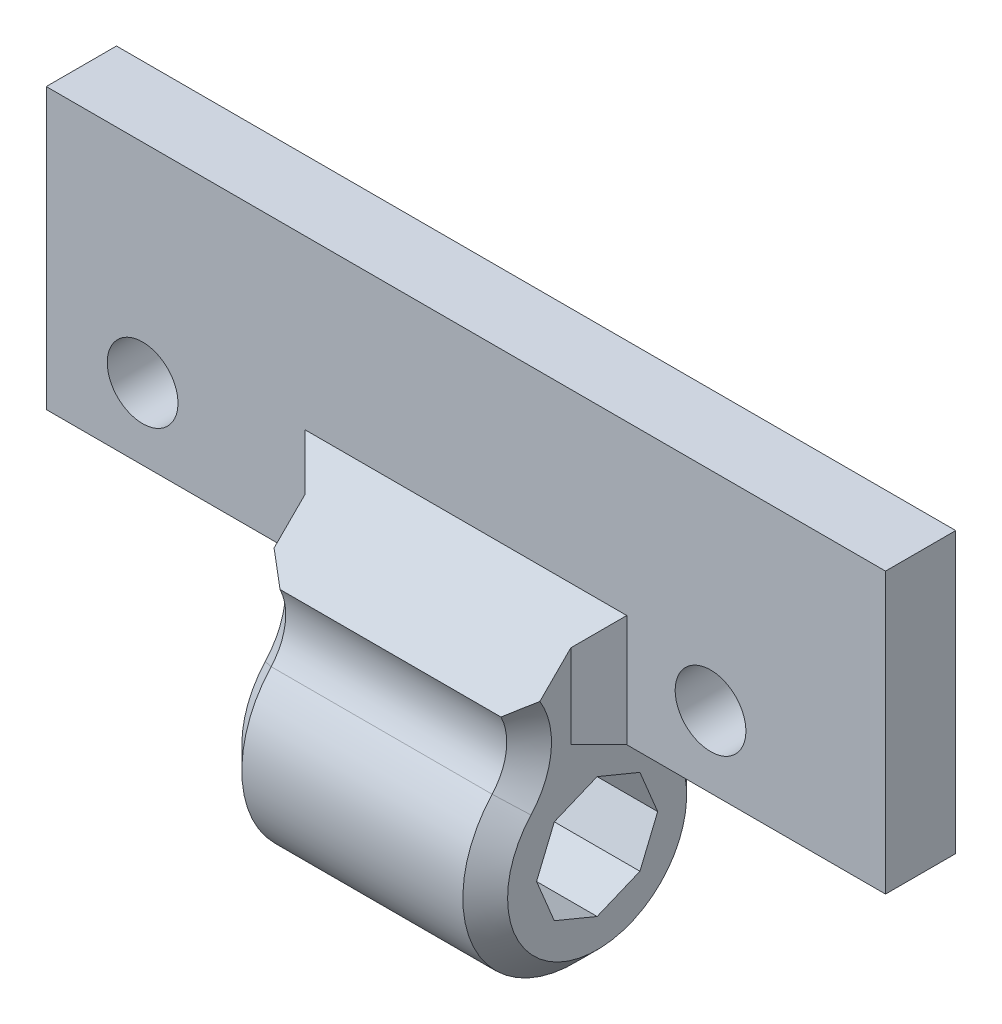
ISO-10303-21;
HEADER;
FILE_DESCRIPTION(('STEP AP214'),'2;1');
FILE_NAME('part.step','',(''),(''),'','','');
FILE_SCHEMA(('AUTOMOTIVE_DESIGN { 1 0 10303 214 1 1 1 1 }'));
ENDSEC;
DATA;
#1=APPLICATION_CONTEXT('core data for automotive mechanical design processes');
#2=APPLICATION_PROTOCOL_DEFINITION('international standard','automotive_design',2000,#1);
#3=PRODUCT_CONTEXT('',#1,'mechanical');
#4=PRODUCT('Part','Part','',(#3));
#5=PRODUCT_RELATED_PRODUCT_CATEGORY('part','',(#4));
#6=PRODUCT_DEFINITION_FORMATION('','',#4);
#7=PRODUCT_DEFINITION_CONTEXT('part definition',#1,'design');
#8=PRODUCT_DEFINITION('design','',#6,#7);
#9=PRODUCT_DEFINITION_SHAPE('','',#8);
#10=(LENGTH_UNIT() NAMED_UNIT(*) SI_UNIT(.MILLI.,.METRE.));
#11=(NAMED_UNIT(*) PLANE_ANGLE_UNIT() SI_UNIT($,.RADIAN.));
#12=(NAMED_UNIT(*) SI_UNIT($,.STERADIAN.) SOLID_ANGLE_UNIT());
#13=UNCERTAINTY_MEASURE_WITH_UNIT(LENGTH_MEASURE(1.E-05),#10,'distance_accuracy_value','');
#14=(GEOMETRIC_REPRESENTATION_CONTEXT(3) GLOBAL_UNCERTAINTY_ASSIGNED_CONTEXT((#13)) GLOBAL_UNIT_ASSIGNED_CONTEXT((#10,
#11,#12)) REPRESENTATION_CONTEXT('',''));
#15=CARTESIAN_POINT('',(0.,0.,0.));
#16=DIRECTION('',(0.,0.,1.));
#17=DIRECTION('',(1.,0.,0.));
#18=AXIS2_PLACEMENT_3D('',#15,#16,#17);
#19=CARTESIAN_POINT('',(10.25,0.423050926233683,7.));
#20=DIRECTION('',(1.,0.,0.));
#21=DIRECTION('',(0.,0.,-1.));
#22=AXIS2_PLACEMENT_3D('',#19,#20,#21);
#23=CYLINDRICAL_SURFACE('',#22,2.);
#24=CARTESIAN_POINT('',(18.95,0.423050926233683,7.));
#25=DIRECTION('',(-1.,0.,0.));
#26=DIRECTION('',(0.,0.,1.));
#27=AXIS2_PLACEMENT_3D('',#24,#25,#26);
#28=CIRCLE('',#27,2.);
#29=CARTESIAN_POINT('',(18.95,-0.925455628658212,5.52299963730079));
#30=VERTEX_POINT('',#29);
#31=CARTESIAN_POINT('',(18.95,1.30483529483931,5.20487985714527));
#32=VERTEX_POINT('',#31);
#33=EDGE_CURVE('E284',#30,#32,#28,.F.);
#34=ORIENTED_EDGE('',*,*,#33,.T.);
#35=DIRECTION('',(1.,0.,0.));
#36=VECTOR('',#35,1.);
#37=CARTESIAN_POINT('',(15.,1.30483529483931,5.20487985714527));
#38=LINE('',#37,#36);
#39=CARTESIAN_POINT('',(11.05,1.30483529483931,5.20487985714527));
#40=VERTEX_POINT('',#39);
#41=EDGE_CURVE('E394',#32,#40,#38,.F.);
#42=ORIENTED_EDGE('',*,*,#41,.T.);
#43=CARTESIAN_POINT('',(11.05,0.423050926233683,7.));
#44=DIRECTION('',(-1.,0.,0.));
#45=DIRECTION('',(0.,0.,1.));
#46=AXIS2_PLACEMENT_3D('',#43,#44,#45);
#47=CIRCLE('',#46,2.);
#48=CARTESIAN_POINT('',(11.05,-0.925455628658212,5.52299963730079));
#49=VERTEX_POINT('',#48);
#50=EDGE_CURVE('E281',#40,#49,#47,.T.);
#51=ORIENTED_EDGE('',*,*,#50,.T.);
#52=DIRECTION('',(1.,0.,0.));
#53=VECTOR('',#52,1.);
#54=CARTESIAN_POINT('',(10.25,-0.925455628658212,5.52299963730079));
#55=LINE('',#54,#53);
#56=EDGE_CURVE('E247',#30,#49,#55,.F.);
#57=ORIENTED_EDGE('',*,*,#56,.F.);
#58=EDGE_LOOP('',(#34,#42,#51,#57));
#59=FACE_BOUND('',#58,.T.);
#60=ADVANCED_FACE('F51',(#59),#23,.F.);
#61=CARTESIAN_POINT('',(19.75,0.423050926233683,7.));
#62=DIRECTION('',(1.,0.,0.));
#63=DIRECTION('',(0.,0.,-1.));
#64=AXIS2_PLACEMENT_3D('',#61,#62,#63);
#65=CONICAL_SURFACE('',#64,2.79999999999999,0.78539816339745);
#66=CARTESIAN_POINT('',(19.75,0.423050926233683,7.));
#67=DIRECTION('',(-1.,0.,0.));
#68=DIRECTION('',(0.,0.,1.));
#69=AXIS2_PLACEMENT_3D('',#66,#67,#68);
#70=CIRCLE('',#69,2.79999999999999);
#71=CARTESIAN_POINT('',(19.75,1.89289658457648,4.6168185674081));
#72=VERTEX_POINT('',#71);
#73=CARTESIAN_POINT('',(19.75,-1.46485825061497,4.93219949222111));
#74=VERTEX_POINT('',#73);
#75=EDGE_CURVE('E269',#72,#74,#70,.T.);
#76=ORIENTED_EDGE('',*,*,#75,.F.);
#77=CARTESIAN_POINT('',(19.75,1.89289658457648,4.6168185674081));
#78=CARTESIAN_POINT('',(19.6829388590441,1.84416040609741,4.66555474588717));
#79=CARTESIAN_POINT('',(19.6159432884619,1.79537898819799,4.71433616378659));
#80=CARTESIAN_POINT('',(19.4821294840869,1.69769578992014,4.81201936206444));
#81=CARTESIAN_POINT('',(19.4153112482874,1.64879401091593,4.86092114106865));
#82=CARTESIAN_POINT('',(19.2818964349863,1.55083884476995,4.95887630721463));
#83=CARTESIAN_POINT('',(19.2152998586435,1.50178545683823,5.00792969514635));
#84=CARTESIAN_POINT('',(19.0824058751857,1.40347547008604,5.10623968189855));
#85=CARTESIAN_POINT('',(19.0161084715127,1.35421886893998,5.1554962830446));
#86=CARTESIAN_POINT('',(18.95,1.30483529483931,5.20487985714527));
#87=B_SPLINE_CURVE_WITH_KNOTS('',3,(#77,#78,#79,#80,#81,#82,#83,#84,#85,#86),.UNSPECIFIED.,.F.,
.F.,(4,2,2,2,4),(0.,0.288493877865173,0.576984476983937,0.865476581809861,1.15397199735648),.UNSPECIFIED.);
#88=EDGE_CURVE('E358',#72,#32,#87,.T.);
#89=ORIENTED_EDGE('',*,*,#88,.T.);
#90=ORIENTED_EDGE('',*,*,#33,.F.);
#91=DIRECTION('',(-0.707106781186546,0.476769064719285,0.522198486139801));
#92=VECTOR('',#91,1.);
#93=CARTESIAN_POINT('',(19.75,-1.46485825061497,4.93219949222111));
#94=LINE('',#93,#92);
#95=EDGE_CURVE('E411',#74,#30,#94,.T.);
#96=ORIENTED_EDGE('',*,*,#95,.F.);
#97=EDGE_LOOP('',(#76,#89,#90,#96));
#98=FACE_BOUND('',#97,.T.);
#99=ADVANCED_FACE('F345',(#98),#65,.F.);
#100=CARTESIAN_POINT('',(10.25,0.423050926233683,7.));
#101=DIRECTION('',(-1.,0.,0.));
#102=DIRECTION('',(0.,0.,1.));
#103=AXIS2_PLACEMENT_3D('',#100,#101,#102);
#104=CONICAL_SURFACE('',#103,2.79999999999999,0.785398163397447);
#105=ORIENTED_EDGE('',*,*,#50,.F.);
#106=CARTESIAN_POINT('',(11.05,1.30483529483931,5.20487985714527));
#107=CARTESIAN_POINT('',(10.9838915284873,1.35421886893998,5.1554962830446));
#108=CARTESIAN_POINT('',(10.9175941248143,1.40347547008604,5.10623968189855));
#109=CARTESIAN_POINT('',(10.7847001413565,1.50178545683823,5.00792969514635));
#110=CARTESIAN_POINT('',(10.7181035650137,1.55083884476995,4.95887630721463));
#111=CARTESIAN_POINT('',(10.5846887517126,1.64879401091593,4.86092114106865));
#112=CARTESIAN_POINT('',(10.5178705159131,1.69769578992014,4.81201936206444));
#113=CARTESIAN_POINT('',(10.3840567115381,1.79537898819799,4.71433616378659));
#114=CARTESIAN_POINT('',(10.3170611409559,1.84416040609741,4.66555474588717));
#115=CARTESIAN_POINT('',(10.25,1.89289658457648,4.6168185674081));
#116=B_SPLINE_CURVE_WITH_KNOTS('',3,(#106,#107,#108,#109,#110,#111,#112,#113,#114,#115),
.UNSPECIFIED.,.F.,.F.,(4,2,2,2,4),(0.,0.288495415546617,0.576987520372544,0.86547811949131,
1.15397199735648),.UNSPECIFIED.);
#117=CARTESIAN_POINT('',(10.25,1.89289658457648,4.6168185674081));
#118=VERTEX_POINT('',#117);
#119=EDGE_CURVE('E385',#40,#118,#116,.T.);
#120=ORIENTED_EDGE('',*,*,#119,.T.);
#121=CARTESIAN_POINT('',(10.25,0.423050926233683,7.));
#122=DIRECTION('',(-1.,0.,0.));
#123=DIRECTION('',(0.,0.,1.));
#124=AXIS2_PLACEMENT_3D('',#121,#122,#123);
#125=CIRCLE('',#124,2.8);
#126=CARTESIAN_POINT('',(10.25,-1.46485825061497,4.93219949222111));
#127=VERTEX_POINT('',#126);
#128=EDGE_CURVE('E296',#127,#118,#125,.F.);
#129=ORIENTED_EDGE('',*,*,#128,.F.);
#130=DIRECTION('',(-0.707106781186549,-0.476769064719283,-0.522198486139799));
#131=VECTOR('',#130,1.);
#132=CARTESIAN_POINT('',(11.05,-0.925455628658212,5.52299963730079));
#133=LINE('',#132,#131);
#134=EDGE_CURVE('E431',#49,#127,#133,.T.);
#135=ORIENTED_EDGE('',*,*,#134,.F.);
#136=EDGE_LOOP('',(#105,#120,#129,#135));
#137=FACE_BOUND('',#136,.T.);
#138=ADVANCED_FACE('F351',(#137),#104,.F.);
#139=CARTESIAN_POINT('',(0.,0.,5.));
#140=DIRECTION('',(0.,1.,0.));
#141=DIRECTION('',(0.,0.,1.));
#142=AXIS2_PLACEMENT_3D('',#139,#140,#141);
#143=PLANE('',#142);
#144=DIRECTION('',(0.,0.,-1.));
#145=VECTOR('',#144,1.);
#146=CARTESIAN_POINT('',(30.,0.,5.));
#147=LINE('',#146,#145);
#148=CARTESIAN_POINT('',(30.,0.,2.50971515198453));
#149=VERTEX_POINT('',#148);
#150=CARTESIAN_POINT('',(30.,0.,0.));
#151=VERTEX_POINT('',#150);
#152=EDGE_CURVE('E248',#149,#151,#147,.T.);
#153=ORIENTED_EDGE('',*,*,#152,.F.);
#154=DIRECTION('',(-1.,0.,0.));
#155=VECTOR('',#154,1.);
#156=CARTESIAN_POINT('',(40.7126981506466,0.,2.50971515198453));
#157=LINE('',#156,#155);
#158=CARTESIAN_POINT('',(20.75,0.,2.50971515198453));
#159=VERTEX_POINT('',#158);
#160=EDGE_CURVE('E231',#149,#159,#157,.T.);
#161=ORIENTED_EDGE('',*,*,#160,.T.);
#162=DIRECTION('',(0.707106781186551,0.,-0.707106781186544));
#163=VECTOR('',#162,1.);
#164=CARTESIAN_POINT('',(9.12985757599216,0.,14.1298575759923));
#165=LINE('',#164,#163);
#166=CARTESIAN_POINT('',(19.75,0.,3.50971515198453));
#167=VERTEX_POINT('',#166);
#168=EDGE_CURVE('E61',#159,#167,#165,.F.);
#169=ORIENTED_EDGE('',*,*,#168,.T.);
#170=DIRECTION('',(0.,0.,1.));
#171=VECTOR('',#170,1.);
#172=CARTESIAN_POINT('',(19.75,0.,0.));
#173=LINE('',#172,#171);
#174=CARTESIAN_POINT('',(19.75,0.,0.787286498537844));
#175=VERTEX_POINT('',#174);
#176=EDGE_CURVE('E68',#175,#167,#173,.T.);
#177=ORIENTED_EDGE('',*,*,#176,.F.);
#178=CARTESIAN_POINT('',(19.75,0.,0.787286498537844));
#179=CARTESIAN_POINT('',(19.6194776927101,0.,0.656206935488562));
#180=CARTESIAN_POINT('',(19.4890232373199,0.,0.52505994860462));
#181=CARTESIAN_POINT('',(19.2282500190135,0.,0.262631115770384));
#182=CARTESIAN_POINT('',(19.0979312561092,0.,0.131349269808379));
#183=CARTESIAN_POINT('',(18.9676803451163,0.,0.));
#184=B_SPLINE_CURVE_WITH_KNOTS('',3,(#178,#179,#180,#181,#182,#183),.UNSPECIFIED.,.F.,.F.,(4,2,
4),(0.,0.554942405929777,1.10988486006077),.UNSPECIFIED.);
#185=CARTESIAN_POINT('',(18.9676803451163,0.,0.));
#186=VERTEX_POINT('',#185);
#187=EDGE_CURVE('E303',#175,#186,#184,.T.);
#188=ORIENTED_EDGE('',*,*,#187,.T.);
#189=DIRECTION('',(1.,0.,0.));
#190=VECTOR('',#189,1.);
#191=CARTESIAN_POINT('',(0.,0.,0.));
#192=LINE('',#191,#190);
#193=EDGE_CURVE('E533',#186,#151,#192,.T.);
#194=ORIENTED_EDGE('',*,*,#193,.T.);
#195=EDGE_LOOP('',(#153,#161,#169,#177,#188,#194));
#196=FACE_BOUND('',#195,.T.);
#197=ADVANCED_FACE('F459',(#196),#143,.F.);
#198=CARTESIAN_POINT('',(0.,0.,0.));
#199=DIRECTION('',(0.,0.,-1.));
#200=DIRECTION('',(-1.,0.,0.));
#201=AXIS2_PLACEMENT_3D('',#198,#199,#200);
#202=PLANE('',#201);
#203=CARTESIAN_POINT('',(3.44407637494714,2.55,0.));
#204=DIRECTION('',(0.,0.,1.));
#205=DIRECTION('',(1.,0.,0.));
#206=AXIS2_PLACEMENT_3D('',#203,#204,#205);
#207=CIRCLE('',#206,1.26424784205317);
#208=CARTESIAN_POINT('',(4.70832421700031,2.55,0.));
#209=VERTEX_POINT('',#208);
#210=EDGE_CURVE('E527',#209,#209,#207,.T.);
#211=ORIENTED_EDGE('',*,*,#210,.T.);
#212=EDGE_LOOP('',(#211));
#213=FACE_BOUND('',#212,.T.);
#214=ORIENTED_EDGE('',*,*,#193,.F.);
#215=CARTESIAN_POINT('',(18.9676803451163,0.,0.));
#216=CARTESIAN_POINT('',(18.9618095819706,0.0442261466992125,0.));
#217=CARTESIAN_POINT('',(18.9574008383588,0.0885492800324076,0.));
#218=CARTESIAN_POINT('',(18.9515073620762,0.177389943962471,0.));
#219=CARTESIAN_POINT('',(18.9500226573159,0.221907476410847,0.));
#220=CARTESIAN_POINT('',(18.95,0.266521997344715,0.));
#221=B_SPLINE_CURVE_WITH_KNOTS('',3,(#215,#216,#217,#218,#219,#220),.UNSPECIFIED.,.F.,.F.,(4,2,
4),(0.,0.133625575839211,0.26725242715158),.UNSPECIFIED.);
#222=CARTESIAN_POINT('',(18.95,0.266521997344716,0.));
#223=VERTEX_POINT('',#222);
#224=EDGE_CURVE('E313',#186,#223,#221,.T.);
#225=ORIENTED_EDGE('',*,*,#224,.T.);
#226=DIRECTION('',(1.,0.,0.));
#227=VECTOR('',#226,1.);
#228=CARTESIAN_POINT('',(0.,0.266521997344716,0.));
#229=LINE('',#228,#227);
#230=CARTESIAN_POINT('',(11.05,0.266521997344716,0.));
#231=VERTEX_POINT('',#230);
#232=EDGE_CURVE('E262',#223,#231,#229,.F.);
#233=ORIENTED_EDGE('',*,*,#232,.T.);
#234=CARTESIAN_POINT('',(11.05,0.266521997344716,0.));
#235=CARTESIAN_POINT('',(11.0499773426841,0.221907476410848,0.));
#236=CARTESIAN_POINT('',(11.0484926379238,0.177389943962471,0.));
#237=CARTESIAN_POINT('',(11.0425991616412,0.0885492800324077,0.));
#238=CARTESIAN_POINT('',(11.0381904180294,0.0442261466992125,0.));
#239=CARTESIAN_POINT('',(11.0323196548837,0.,0.));
#240=B_SPLINE_CURVE_WITH_KNOTS('',3,(#234,#235,#236,#237,#238,#239),.UNSPECIFIED.,.F.,.F.,(4,2,
4),(0.,0.133626851312369,0.26725242715158),.UNSPECIFIED.);
#241=CARTESIAN_POINT('',(11.0323196548837,0.,0.));
#242=VERTEX_POINT('',#241);
#243=EDGE_CURVE('E422',#231,#242,#240,.T.);
#244=ORIENTED_EDGE('',*,*,#243,.T.);
#245=CARTESIAN_POINT('',(0.,0.,0.));
#246=VERTEX_POINT('',#245);
#247=EDGE_CURVE('E534',#246,#242,#192,.T.);
#248=ORIENTED_EDGE('',*,*,#247,.F.);
#249=DIRECTION('',(0.,-1.,0.));
#250=VECTOR('',#249,1.);
#251=CARTESIAN_POINT('',(0.,0.,0.));
#252=LINE('',#251,#250);
#253=CARTESIAN_POINT('',(0.,10.,0.));
#254=VERTEX_POINT('',#253);
#255=EDGE_CURVE('E245',#254,#246,#252,.T.);
#256=ORIENTED_EDGE('',*,*,#255,.F.);
#257=DIRECTION('',(-1.,0.,0.));
#258=VECTOR('',#257,1.);
#259=CARTESIAN_POINT('',(0.,10.,0.));
#260=LINE('',#259,#258);
#261=CARTESIAN_POINT('',(30.,10.,0.));
#262=VERTEX_POINT('',#261);
#263=EDGE_CURVE('E541',#262,#254,#260,.T.);
#264=ORIENTED_EDGE('',*,*,#263,.F.);
#265=DIRECTION('',(0.,1.,0.));
#266=VECTOR('',#265,1.);
#267=CARTESIAN_POINT('',(30.,0.,0.));
#268=LINE('',#267,#266);
#269=EDGE_CURVE('E537',#151,#262,#268,.T.);
#270=ORIENTED_EDGE('',*,*,#269,.F.);
#271=EDGE_LOOP('',(#214,#225,#233,#244,#248,#256,#264,#270));
#272=FACE_BOUND('',#271,.T.);
#273=CARTESIAN_POINT('',(23.7440763749471,2.55,0.));
#274=DIRECTION('',(0.,0.,1.));
#275=DIRECTION('',(1.,0.,0.));
#276=AXIS2_PLACEMENT_3D('',#273,#274,#275);
#277=CIRCLE('',#276,1.26424784205317);
#278=CARTESIAN_POINT('',(25.0083242170003,2.55,0.));
#279=VERTEX_POINT('',#278);
#280=EDGE_CURVE('E523',#279,#279,#277,.T.);
#281=ORIENTED_EDGE('',*,*,#280,.T.);
#282=EDGE_LOOP('',(#281));
#283=FACE_BOUND('',#282,.T.);
#284=ADVANCED_FACE('F454',(#213,#272,#283),#202,.T.);
#285=CARTESIAN_POINT('',(0.,0.,5.));
#286=DIRECTION('',(1.,0.,0.));
#287=DIRECTION('',(0.,0.,-1.));
#288=AXIS2_PLACEMENT_3D('',#285,#286,#287);
#289=PLANE('',#288);
#290=DIRECTION('',(0.,0.,-1.));
#291=VECTOR('',#290,1.);
#292=CARTESIAN_POINT('',(0.,0.,5.));
#293=LINE('',#292,#291);
#294=CARTESIAN_POINT('',(0.,0.,2.50971515198453));
#295=VERTEX_POINT('',#294);
#296=EDGE_CURVE('E223',#295,#246,#293,.T.);
#297=ORIENTED_EDGE('',*,*,#296,.F.);
#298=DIRECTION('',(0.,-1.,0.));
#299=VECTOR('',#298,1.);
#300=CARTESIAN_POINT('',(0.,0.,2.50971515198453));
#301=LINE('',#300,#299);
#302=CARTESIAN_POINT('',(0.,10.,2.50971515198453));
#303=VERTEX_POINT('',#302);
#304=EDGE_CURVE('E235',#303,#295,#301,.T.);
#305=ORIENTED_EDGE('',*,*,#304,.F.);
#306=DIRECTION('',(0.,0.,-1.));
#307=VECTOR('',#306,1.);
#308=CARTESIAN_POINT('',(0.,10.,5.));
#309=LINE('',#308,#307);
#310=EDGE_CURVE('E545',#303,#254,#309,.T.);
#311=ORIENTED_EDGE('',*,*,#310,.T.);
#312=ORIENTED_EDGE('',*,*,#255,.T.);
#313=EDGE_LOOP('',(#297,#305,#311,#312));
#314=FACE_BOUND('',#313,.T.);
#315=ADVANCED_FACE('F243',(#314),#289,.F.);
#316=DIRECTION('',(0.,0.,1.));
#317=VECTOR('',#316,1.);
#318=CARTESIAN_POINT('',(10.25,0.,0.));
#319=LINE('',#318,#317);
#320=CARTESIAN_POINT('',(10.25,0.,0.787286498537845));
#321=VERTEX_POINT('',#320);
#322=CARTESIAN_POINT('',(10.25,0.,3.50971515198453));
#323=VERTEX_POINT('',#322);
#324=EDGE_CURVE('E502',#321,#323,#319,.T.);
#325=ORIENTED_EDGE('',*,*,#324,.T.);
#326=DIRECTION('',(-0.707106781186551,0.,-0.707106781186544));
#327=VECTOR('',#326,1.);
#328=CARTESIAN_POINT('',(5.87014242400769,0.,-0.870142424007744));
#329=LINE('',#328,#327);
#330=CARTESIAN_POINT('',(9.24999999999999,0.,2.50971515198453));
#331=VERTEX_POINT('',#330);
#332=EDGE_CURVE('E226',#323,#331,#329,.T.);
#333=ORIENTED_EDGE('',*,*,#332,.T.);
#334=EDGE_CURVE('E219',#331,#295,#157,.T.);
#335=ORIENTED_EDGE('',*,*,#334,.T.);
#336=ORIENTED_EDGE('',*,*,#296,.T.);
#337=ORIENTED_EDGE('',*,*,#247,.T.);
#338=CARTESIAN_POINT('',(11.0323196548837,0.,0.));
#339=CARTESIAN_POINT('',(10.9020687438908,0.,0.131349269808379));
#340=CARTESIAN_POINT('',(10.7717499809865,0.,0.262631115770385));
#341=CARTESIAN_POINT('',(10.5109767626801,0.,0.525059948604621));
#342=CARTESIAN_POINT('',(10.3805223072899,0.,0.656206935488563));
#343=CARTESIAN_POINT('',(10.25,0.,0.787286498537845));
#344=B_SPLINE_CURVE_WITH_KNOTS('',3,(#338,#339,#340,#341,#342,#343),.UNSPECIFIED.,.F.,.F.,(4,2,
4),(0.,0.554942454130996,1.10988486006077),.UNSPECIFIED.);
#345=EDGE_CURVE('E419',#242,#321,#344,.T.);
#346=ORIENTED_EDGE('',*,*,#345,.T.);
#347=EDGE_LOOP('',(#325,#333,#335,#336,#337,#346));
#348=FACE_BOUND('',#347,.T.);
#349=ADVANCED_FACE('F221',(#348),#143,.F.);
#350=CARTESIAN_POINT('',(30.,0.,5.));
#351=DIRECTION('',(-1.,0.,0.));
#352=DIRECTION('',(0.,0.,1.));
#353=AXIS2_PLACEMENT_3D('',#350,#351,#352);
#354=PLANE('',#353);
#355=DIRECTION('',(0.,0.,-1.));
#356=VECTOR('',#355,1.);
#357=CARTESIAN_POINT('',(30.,10.,5.));
#358=LINE('',#357,#356);
#359=CARTESIAN_POINT('',(30.,10.,2.50971515198453));
#360=VERTEX_POINT('',#359);
#361=EDGE_CURVE('E255',#360,#262,#358,.T.);
#362=ORIENTED_EDGE('',*,*,#361,.F.);
#363=DIRECTION('',(0.,1.,0.));
#364=VECTOR('',#363,1.);
#365=CARTESIAN_POINT('',(30.,0.,2.50971515198453));
#366=LINE('',#365,#364);
#367=EDGE_CURVE('E430',#149,#360,#366,.T.);
#368=ORIENTED_EDGE('',*,*,#367,.F.);
#369=ORIENTED_EDGE('',*,*,#152,.T.);
#370=ORIENTED_EDGE('',*,*,#269,.T.);
#371=EDGE_LOOP('',(#362,#368,#369,#370));
#372=FACE_BOUND('',#371,.T.);
#373=ADVANCED_FACE('F466',(#372),#354,.F.);
#374=CARTESIAN_POINT('',(0.,10.,5.));
#375=DIRECTION('',(0.,-1.,0.));
#376=DIRECTION('',(0.,0.,-1.));
#377=AXIS2_PLACEMENT_3D('',#374,#375,#376);
#378=PLANE('',#377);
#379=ORIENTED_EDGE('',*,*,#310,.F.);
#380=DIRECTION('',(-1.,0.,0.));
#381=VECTOR('',#380,1.);
#382=CARTESIAN_POINT('',(40.7126981506466,10.,2.50971515198453));
#383=LINE('',#382,#381);
#384=EDGE_CURVE('E232',#360,#303,#383,.T.);
#385=ORIENTED_EDGE('',*,*,#384,.F.);
#386=ORIENTED_EDGE('',*,*,#361,.T.);
#387=ORIENTED_EDGE('',*,*,#263,.T.);
#388=EDGE_LOOP('',(#379,#385,#386,#387));
#389=FACE_BOUND('',#388,.T.);
#390=ADVANCED_FACE('F463',(#389),#378,.F.);
#391=CARTESIAN_POINT('',(3.44407637494714,2.55,5.));
#392=DIRECTION('',(0.,0.,-1.));
#393=DIRECTION('',(-1.,0.,0.));
#394=AXIS2_PLACEMENT_3D('',#391,#392,#393);
#395=CYLINDRICAL_SURFACE('',#394,1.26424784205317);
#396=CARTESIAN_POINT('',(3.44407637494714,2.55,2.50971515198453));
#397=DIRECTION('',(0.,0.,-1.));
#398=DIRECTION('',(-1.,0.,0.));
#399=AXIS2_PLACEMENT_3D('',#396,#397,#398);
#400=CIRCLE('',#399,1.26424784205317);
#401=CARTESIAN_POINT('',(2.17982853289397,2.55,2.50971515198453));
#402=VERTEX_POINT('',#401);
#403=EDGE_CURVE('E429',#402,#402,#400,.T.);
#404=ORIENTED_EDGE('',*,*,#403,.F.);
#405=EDGE_LOOP('',(#404));
#406=FACE_BOUND('',#405,.T.);
#407=ORIENTED_EDGE('',*,*,#210,.F.);
#408=EDGE_LOOP('',(#407));
#409=FACE_BOUND('',#408,.T.);
#410=ADVANCED_FACE('F461',(#406,#409),#395,.F.);
#411=CARTESIAN_POINT('',(23.7440763749471,2.55,5.));
#412=DIRECTION('',(0.,0.,-1.));
#413=DIRECTION('',(-1.,0.,0.));
#414=AXIS2_PLACEMENT_3D('',#411,#412,#413);
#415=CYLINDRICAL_SURFACE('',#414,1.26424784205317);
#416=CARTESIAN_POINT('',(23.7440763749471,2.55,2.50971515198453));
#417=DIRECTION('',(0.,0.,-1.));
#418=DIRECTION('',(-1.,0.,0.));
#419=AXIS2_PLACEMENT_3D('',#416,#417,#418);
#420=CIRCLE('',#419,1.26424784205317);
#421=CARTESIAN_POINT('',(22.479828532894,2.55,2.50971515198453));
#422=VERTEX_POINT('',#421);
#423=EDGE_CURVE('E425',#422,#422,#420,.T.);
#424=ORIENTED_EDGE('',*,*,#423,.F.);
#425=EDGE_LOOP('',(#424));
#426=FACE_BOUND('',#425,.T.);
#427=ORIENTED_EDGE('',*,*,#280,.F.);
#428=EDGE_LOOP('',(#427));
#429=FACE_BOUND('',#428,.T.);
#430=ADVANCED_FACE('F687',(#426,#429),#415,.F.);
#431=CARTESIAN_POINT('',(10.25,-3.622468738442,2.56899891190238));
#432=DIRECTION('',(1.,0.,0.));
#433=DIRECTION('',(0.,0.,-1.));
#434=AXIS2_PLACEMENT_3D('',#431,#432,#433);
#435=CYLINDRICAL_SURFACE('',#434,4.);
#436=DIRECTION('',(1.,0.,0.));
#437=VECTOR('',#436,1.);
#438=CARTESIAN_POINT('',(10.25,-1.02980824791752,-0.477000362699209));
#439=LINE('',#438,#437);
#440=CARTESIAN_POINT('',(11.05,-1.02980824791752,-0.477000362699209));
#441=VERTEX_POINT('',#440);
#442=CARTESIAN_POINT('',(18.95,-1.02980824791752,-0.477000362699209));
#443=VERTEX_POINT('',#442);
#444=EDGE_CURVE('E253',#441,#443,#439,.T.);
#445=ORIENTED_EDGE('',*,*,#444,.T.);
#446=CARTESIAN_POINT('',(18.95,-3.622468738442,2.56899891190238));
#447=DIRECTION('',(-1.,0.,0.));
#448=DIRECTION('',(0.,0.,1.));
#449=AXIS2_PLACEMENT_3D('',#446,#447,#448);
#450=CIRCLE('',#449,4.);
#451=EDGE_CURVE('E290',#443,#30,#450,.T.);
#452=ORIENTED_EDGE('',*,*,#451,.T.);
#453=ORIENTED_EDGE('',*,*,#56,.T.);
#454=CARTESIAN_POINT('',(11.05,-3.622468738442,2.56899891190238));
#455=DIRECTION('',(-1.,0.,0.));
#456=DIRECTION('',(0.,0.,1.));
#457=AXIS2_PLACEMENT_3D('',#454,#455,#456);
#458=CIRCLE('',#457,4.);
#459=EDGE_CURVE('E287',#49,#441,#458,.F.);
#460=ORIENTED_EDGE('',*,*,#459,.T.);
#461=EDGE_LOOP('',(#445,#452,#453,#460));
#462=FACE_BOUND('',#461,.T.);
#463=ADVANCED_FACE('F681',(#462),#435,.T.);
#464=CARTESIAN_POINT('',(10.25,-0.67340967543,1.62575477145642));
#465=DIRECTION('',(0.,-0.382683432365079,0.923879532511291));
#466=DIRECTION('',(0.,-0.923879532511291,-0.382683432365079));
#467=AXIS2_PLACEMENT_3D('',#464,#465,#466);
#468=PLANE('',#467);
#469=DIRECTION('',(0.,-0.923879532511291,-0.382683432365079));
#470=VECTOR('',#469,1.);
#471=CARTESIAN_POINT('',(19.75,-0.67340967543,1.62575477145642));
#472=LINE('',#471,#470);
#473=CARTESIAN_POINT('',(19.75,-2.09173500898166,1.038265182442));
#474=VERTEX_POINT('',#473);
#475=CARTESIAN_POINT('',(19.75,-3.62246873844203,0.404214511317587));
#476=VERTEX_POINT('',#475);
#477=EDGE_CURVE('E441',#474,#476,#472,.T.);
#478=ORIENTED_EDGE('',*,*,#477,.F.);
#479=DIRECTION('',(1.,0.,0.));
#480=VECTOR('',#479,1.);
#481=CARTESIAN_POINT('',(10.25,-2.09173500898166,1.038265182442));
#482=LINE('',#481,#480);
#483=CARTESIAN_POINT('',(10.25,-2.09173500898166,1.038265182442));
#484=VERTEX_POINT('',#483);
#485=EDGE_CURVE('E520',#484,#474,#482,.T.);
#486=ORIENTED_EDGE('',*,*,#485,.F.);
#487=DIRECTION('',(0.,-0.923879532511291,-0.382683432365079));
#488=VECTOR('',#487,1.);
#489=CARTESIAN_POINT('',(10.25,-0.67340967543,1.62575477145642));
#490=LINE('',#489,#488);
#491=CARTESIAN_POINT('',(10.25,-3.62246873844203,0.404214511317587));
#492=VERTEX_POINT('',#491);
#493=EDGE_CURVE('E485',#484,#492,#490,.T.);
#494=ORIENTED_EDGE('',*,*,#493,.T.);
#495=DIRECTION('',(1.,0.,0.));
#496=VECTOR('',#495,1.);
#497=CARTESIAN_POINT('',(10.25,-3.62246873844203,0.404214511317587));
#498=LINE('',#497,#496);
#499=EDGE_CURVE('E498',#492,#476,#498,.T.);
#500=ORIENTED_EDGE('',*,*,#499,.T.);
#501=EDGE_LOOP('',(#478,#486,#494,#500));
#502=FACE_BOUND('',#501,.T.);
#503=ADVANCED_FACE('F679',(#502),#468,.T.);
#504=CARTESIAN_POINT('',(10.25,-2.15248968472625,0.891590420281828));
#505=DIRECTION('',(0.,-0.923879532511283,0.3826834323651));
#506=DIRECTION('',(0.,-0.3826834323651,-0.923879532511283));
#507=AXIS2_PLACEMENT_3D('',#504,#505,#506);
#508=PLANE('',#507);
#509=DIRECTION('',(0.,-0.3826834323651,-0.923879532511283));
#510=VECTOR('',#509,1.);
#511=CARTESIAN_POINT('',(19.75,-2.15248968472625,0.891590420281828));
#512=LINE('',#511,#510);
#513=CARTESIAN_POINT('',(19.75,-1.45768433785721,2.56899891190235));
#514=VERTEX_POINT('',#513);
#515=EDGE_CURVE('E626',#514,#474,#512,.T.);
#516=ORIENTED_EDGE('',*,*,#515,.F.);
#517=DIRECTION('',(1.,0.,0.));
#518=VECTOR('',#517,1.);
#519=CARTESIAN_POINT('',(10.25,-1.45768433785721,2.56899891190235));
#520=LINE('',#519,#518);
#521=CARTESIAN_POINT('',(10.25,-1.45768433785721,2.56899891190235));
#522=VERTEX_POINT('',#521);
#523=EDGE_CURVE('E517',#522,#514,#520,.T.);
#524=ORIENTED_EDGE('',*,*,#523,.F.);
#525=DIRECTION('',(0.,-0.3826834323651,-0.923879532511283));
#526=VECTOR('',#525,1.);
#527=CARTESIAN_POINT('',(10.25,-2.15248968472625,0.891590420281828));
#528=LINE('',#527,#526);
#529=EDGE_CURVE('E491',#522,#484,#528,.T.);
#530=ORIENTED_EDGE('',*,*,#529,.T.);
#531=ORIENTED_EDGE('',*,*,#485,.T.);
#532=EDGE_LOOP('',(#516,#524,#530,#531));
#533=FACE_BOUND('',#532,.T.);
#534=ADVANCED_FACE('F672',(#533),#508,.T.);
#535=CARTESIAN_POINT('',(10.25,-0.335933133259261,-0.13914805984647));
#536=DIRECTION('',(0.,-0.923879532511291,-0.382683432365079));
#537=DIRECTION('',(0.,0.382683432365079,-0.923879532511291));
#538=AXIS2_PLACEMENT_3D('',#535,#536,#537);
#539=PLANE('',#538);
#540=DIRECTION('',(0.,0.382683432365079,-0.923879532511291));
#541=VECTOR('',#540,1.);
#542=CARTESIAN_POINT('',(19.75,-0.335933133259261,-0.13914805984647));
#543=LINE('',#542,#541);
#544=CARTESIAN_POINT('',(19.75,-2.09173500898162,4.09973264136272));
#545=VERTEX_POINT('',#544);
#546=EDGE_CURVE('E630',#545,#514,#543,.T.);
#547=ORIENTED_EDGE('',*,*,#546,.F.);
#548=DIRECTION('',(1.,0.,0.));
#549=VECTOR('',#548,1.);
#550=CARTESIAN_POINT('',(10.25,-2.09173500898162,4.09973264136272));
#551=LINE('',#550,#549);
#552=CARTESIAN_POINT('',(10.25,-2.09173500898162,4.09973264136272));
#553=VERTEX_POINT('',#552);
#554=EDGE_CURVE('E514',#553,#545,#551,.T.);
#555=ORIENTED_EDGE('',*,*,#554,.F.);
#556=DIRECTION('',(0.,0.382683432365079,-0.923879532511291));
#557=VECTOR('',#556,1.);
#558=CARTESIAN_POINT('',(10.25,-0.335933133259261,-0.13914805984647));
#559=LINE('',#558,#557);
#560=EDGE_CURVE('E600',#553,#522,#559,.T.);
#561=ORIENTED_EDGE('',*,*,#560,.T.);
#562=ORIENTED_EDGE('',*,*,#523,.T.);
#563=EDGE_LOOP('',(#547,#555,#561,#562));
#564=FACE_BOUND('',#563,.T.);
#565=ADVANCED_FACE('F668',(#564),#539,.T.);
#566=CARTESIAN_POINT('',(10.25,1.14314687603701,2.75980069191291));
#567=DIRECTION('',(0.,-0.3826834323651,-0.923879532511283));
#568=DIRECTION('',(0.,0.923879532511283,-0.3826834323651));
#569=AXIS2_PLACEMENT_3D('',#566,#567,#568);
#570=PLANE('',#569);
#571=DIRECTION('',(0.,0.923879532511283,-0.3826834323651));
#572=VECTOR('',#571,1.);
#573=CARTESIAN_POINT('',(19.75,1.14314687603701,2.75980069191291));
#574=LINE('',#573,#572);
#575=CARTESIAN_POINT('',(19.75,-3.62246873844198,4.73378331248716));
#576=VERTEX_POINT('',#575);
#577=EDGE_CURVE('E634',#576,#545,#574,.T.);
#578=ORIENTED_EDGE('',*,*,#577,.F.);
#579=DIRECTION('',(1.,0.,0.));
#580=VECTOR('',#579,1.);
#581=CARTESIAN_POINT('',(10.25,-3.62246873844198,4.73378331248716));
#582=LINE('',#581,#580);
#583=CARTESIAN_POINT('',(10.25,-3.62246873844198,4.73378331248716));
#584=VERTEX_POINT('',#583);
#585=EDGE_CURVE('E511',#584,#576,#582,.T.);
#586=ORIENTED_EDGE('',*,*,#585,.F.);
#587=DIRECTION('',(0.,0.923879532511283,-0.3826834323651));
#588=VECTOR('',#587,1.);
#589=CARTESIAN_POINT('',(10.25,1.14314687603701,2.75980069191291));
#590=LINE('',#589,#588);
#591=EDGE_CURVE('E604',#584,#553,#590,.T.);
#592=ORIENTED_EDGE('',*,*,#591,.T.);
#593=ORIENTED_EDGE('',*,*,#554,.T.);
#594=EDGE_LOOP('',(#578,#586,#592,#593));
#595=FACE_BOUND('',#594,.T.);
#596=ADVANCED_FACE('F664',(#595),#570,.T.);
#597=CARTESIAN_POINT('',(10.25,-2.20414340489031,5.32127290150158));
#598=DIRECTION('',(0.,0.382683432365079,-0.923879532511291));
#599=DIRECTION('',(0.,0.923879532511291,0.382683432365079));
#600=AXIS2_PLACEMENT_3D('',#597,#598,#599);
#601=PLANE('',#600);
#602=DIRECTION('',(0.,0.923879532511291,0.382683432365079));
#603=VECTOR('',#602,1.);
#604=CARTESIAN_POINT('',(19.75,-2.20414340489031,5.32127290150158));
#605=LINE('',#604,#603);
#606=CARTESIAN_POINT('',(19.75,-5.15320246790235,4.09973264136275));
#607=VERTEX_POINT('',#606);
#608=EDGE_CURVE('E638',#607,#576,#605,.T.);
#609=ORIENTED_EDGE('',*,*,#608,.F.);
#610=DIRECTION('',(1.,0.,0.));
#611=VECTOR('',#610,1.);
#612=CARTESIAN_POINT('',(10.25,-5.15320246790235,4.09973264136275));
#613=LINE('',#612,#611);
#614=CARTESIAN_POINT('',(10.25,-5.15320246790235,4.09973264136275));
#615=VERTEX_POINT('',#614);
#616=EDGE_CURVE('E508',#615,#607,#613,.T.);
#617=ORIENTED_EDGE('',*,*,#616,.F.);
#618=DIRECTION('',(0.,0.923879532511291,0.382683432365079));
#619=VECTOR('',#618,1.);
#620=CARTESIAN_POINT('',(10.25,-2.20414340489031,5.32127290150158));
#621=LINE('',#620,#619);
#622=EDGE_CURVE('E608',#615,#584,#621,.T.);
#623=ORIENTED_EDGE('',*,*,#622,.T.);
#624=ORIENTED_EDGE('',*,*,#585,.T.);
#625=EDGE_LOOP('',(#609,#617,#623,#624));
#626=FACE_BOUND('',#625,.T.);
#627=ADVANCED_FACE('F660',(#626),#601,.T.);
#628=CARTESIAN_POINT('',(10.25,-5.84800781477138,2.42232414974223));
#629=DIRECTION('',(0.,0.923879532511282,-0.3826834323651));
#630=DIRECTION('',(0.,0.3826834323651,0.923879532511283));
#631=AXIS2_PLACEMENT_3D('',#628,#629,#630);
#632=PLANE('',#631);
#633=DIRECTION('',(0.,0.3826834323651,0.923879532511283));
#634=VECTOR('',#633,1.);
#635=CARTESIAN_POINT('',(19.75,-5.84800781477138,2.42232414974223));
#636=LINE('',#635,#634);
#637=CARTESIAN_POINT('',(19.75,-5.78725313902679,2.5689989119024));
#638=VERTEX_POINT('',#637);
#639=EDGE_CURVE('E642',#638,#607,#636,.T.);
#640=ORIENTED_EDGE('',*,*,#639,.F.);
#641=DIRECTION('',(1.,0.,0.));
#642=VECTOR('',#641,1.);
#643=CARTESIAN_POINT('',(10.25,-5.78725313902679,2.5689989119024));
#644=LINE('',#643,#642);
#645=CARTESIAN_POINT('',(10.25,-5.78725313902679,2.5689989119024));
#646=VERTEX_POINT('',#645);
#647=EDGE_CURVE('E505',#646,#638,#644,.T.);
#648=ORIENTED_EDGE('',*,*,#647,.F.);
#649=DIRECTION('',(0.,0.3826834323651,0.923879532511283));
#650=VECTOR('',#649,1.);
#651=CARTESIAN_POINT('',(10.25,-5.84800781477138,2.42232414974223));
#652=LINE('',#651,#650);
#653=EDGE_CURVE('E612',#646,#615,#652,.T.);
#654=ORIENTED_EDGE('',*,*,#653,.T.);
#655=ORIENTED_EDGE('',*,*,#616,.T.);
#656=EDGE_LOOP('',(#640,#648,#654,#655));
#657=FACE_BOUND('',#656,.T.);
#658=ADVANCED_FACE('F656',(#657),#632,.T.);
#659=CARTESIAN_POINT('',(10.25,-4.03145126330443,-1.66988178930679));
#660=DIRECTION('',(0.,0.923879532511291,0.382683432365079));
#661=DIRECTION('',(0.,-0.382683432365079,0.923879532511291));
#662=AXIS2_PLACEMENT_3D('',#659,#660,#661);
#663=PLANE('',#662);
#664=DIRECTION('',(0.,-0.382683432365079,0.923879532511291));
#665=VECTOR('',#664,1.);
#666=CARTESIAN_POINT('',(19.75,-4.03145126330443,-1.66988178930679));
#667=LINE('',#666,#665);
#668=CARTESIAN_POINT('',(19.75,-5.15320246790238,1.03826518244203));
#669=VERTEX_POINT('',#668);
#670=EDGE_CURVE('E494',#669,#638,#667,.T.);
#671=ORIENTED_EDGE('',*,*,#670,.F.);
#672=DIRECTION('',(1.,0.,0.));
#673=VECTOR('',#672,1.);
#674=CARTESIAN_POINT('',(10.25,-5.15320246790238,1.03826518244203));
#675=LINE('',#674,#673);
#676=CARTESIAN_POINT('',(10.25,-5.15320246790238,1.03826518244203));
#677=VERTEX_POINT('',#676);
#678=EDGE_CURVE('E501',#677,#669,#675,.T.);
#679=ORIENTED_EDGE('',*,*,#678,.F.);
#680=DIRECTION('',(0.,-0.382683432365079,0.923879532511291));
#681=VECTOR('',#680,1.);
#682=CARTESIAN_POINT('',(10.25,-4.03145126330443,-1.66988178930679));
#683=LINE('',#682,#681);
#684=EDGE_CURVE('E616',#677,#646,#683,.T.);
#685=ORIENTED_EDGE('',*,*,#684,.T.);
#686=ORIENTED_EDGE('',*,*,#647,.T.);
#687=EDGE_LOOP('',(#671,#679,#685,#686));
#688=FACE_BOUND('',#687,.T.);
#689=ADVANCED_FACE('F652',(#688),#663,.T.);
#690=CARTESIAN_POINT('',(10.25,-0.387586853423386,-0.935717438132221));
#691=DIRECTION('',(0.,0.3826834323651,0.923879532511283));
#692=DIRECTION('',(0.,-0.923879532511283,0.3826834323651));
#693=AXIS2_PLACEMENT_3D('',#690,#691,#692);
#694=PLANE('',#693);
#695=DIRECTION('',(0.,-0.923879532511282,0.3826834323651));
#696=VECTOR('',#695,1.);
#697=CARTESIAN_POINT('',(19.75,-0.387586853423386,-0.935717438132221));
#698=LINE('',#697,#696);
#699=EDGE_CURVE('E486',#476,#669,#698,.T.);
#700=ORIENTED_EDGE('',*,*,#699,.F.);
#701=ORIENTED_EDGE('',*,*,#499,.F.);
#702=DIRECTION('',(0.,-0.923879532511282,0.3826834323651));
#703=VECTOR('',#702,1.);
#704=CARTESIAN_POINT('',(10.25,-0.387586853423386,-0.935717438132221));
#705=LINE('',#704,#703);
#706=EDGE_CURVE('E562',#492,#677,#705,.T.);
#707=ORIENTED_EDGE('',*,*,#706,.T.);
#708=ORIENTED_EDGE('',*,*,#678,.T.);
#709=EDGE_LOOP('',(#700,#701,#707,#708));
#710=FACE_BOUND('',#709,.T.);
#711=ADVANCED_FACE('F676',(#710),#694,.T.);
#712=CARTESIAN_POINT('',(10.25,0.,0.));
#713=DIRECTION('',(-1.,0.,0.));
#714=DIRECTION('',(0.,0.,1.));
#715=AXIS2_PLACEMENT_3D('',#712,#713,#714);
#716=PLANE('',#715);
#717=DIRECTION('',(0.,0.707106781186544,-0.707106781186551));
#718=VECTOR('',#717,1.);
#719=CARTESIAN_POINT('',(10.25,0.,6.5097151519846));
#720=LINE('',#719,#718);
#721=CARTESIAN_POINT('',(10.25,3.00000000000004,3.50971515198453));
#722=VERTEX_POINT('',#721);
#723=EDGE_CURVE('E393',#118,#722,#720,.T.);
#724=ORIENTED_EDGE('',*,*,#723,.T.);
#725=DIRECTION('',(0.,-1.,0.));
#726=VECTOR('',#725,1.);
#727=CARTESIAN_POINT('',(10.25,0.,3.50971515198453));
#728=LINE('',#727,#726);
#729=EDGE_CURVE('E560',#722,#323,#728,.T.);
#730=ORIENTED_EDGE('',*,*,#729,.T.);
#731=ORIENTED_EDGE('',*,*,#324,.F.);
#732=CARTESIAN_POINT('',(10.25,0.266521997344716,-2.));
#733=DIRECTION('',(-1.,0.,0.));
#734=DIRECTION('',(0.,0.,1.));
#735=AXIS2_PLACEMENT_3D('',#732,#733,#734);
#736=CIRCLE('',#735,2.8);
#737=CARTESIAN_POINT('',(10.25,-1.54834034602242,0.132199492221104));
#738=VERTEX_POINT('',#737);
#739=EDGE_CURVE('E299',#321,#738,#736,.F.);
#740=ORIENTED_EDGE('',*,*,#739,.T.);
#741=CARTESIAN_POINT('',(10.25,-3.622468738442,2.56899891190238));
#742=DIRECTION('',(-1.,0.,0.));
#743=DIRECTION('',(0.,0.,1.));
#744=AXIS2_PLACEMENT_3D('',#741,#742,#743);
#745=CIRCLE('',#744,3.20000000000001);
#746=EDGE_CURVE('E293',#738,#127,#745,.T.);
#747=ORIENTED_EDGE('',*,*,#746,.T.);
#748=ORIENTED_EDGE('',*,*,#128,.T.);
#749=EDGE_LOOP('',(#724,#730,#731,#740,#747,#748));
#750=FACE_BOUND('',#749,.T.);
#751=ORIENTED_EDGE('',*,*,#493,.F.);
#752=ORIENTED_EDGE('',*,*,#529,.F.);
#753=ORIENTED_EDGE('',*,*,#560,.F.);
#754=ORIENTED_EDGE('',*,*,#591,.F.);
#755=ORIENTED_EDGE('',*,*,#622,.F.);
#756=ORIENTED_EDGE('',*,*,#653,.F.);
#757=ORIENTED_EDGE('',*,*,#684,.F.);
#758=ORIENTED_EDGE('',*,*,#706,.F.);
#759=EDGE_LOOP('',(#751,#752,#753,#754,#755,#756,#757,#758));
#760=FACE_BOUND('',#759,.T.);
#761=ADVANCED_FACE('F558',(#750,#760),#716,.T.);
#762=CARTESIAN_POINT('',(19.75,0.,0.));
#763=DIRECTION('',(-1.,0.,0.));
#764=DIRECTION('',(0.,0.,1.));
#765=AXIS2_PLACEMENT_3D('',#762,#763,#764);
#766=PLANE('',#765);
#767=ORIENTED_EDGE('',*,*,#477,.T.);
#768=ORIENTED_EDGE('',*,*,#699,.T.);
#769=ORIENTED_EDGE('',*,*,#670,.T.);
#770=ORIENTED_EDGE('',*,*,#639,.T.);
#771=ORIENTED_EDGE('',*,*,#608,.T.);
#772=ORIENTED_EDGE('',*,*,#577,.T.);
#773=ORIENTED_EDGE('',*,*,#546,.T.);
#774=ORIENTED_EDGE('',*,*,#515,.T.);
#775=EDGE_LOOP('',(#767,#768,#769,#770,#771,#772,#773,#774));
#776=FACE_BOUND('',#775,.T.);
#777=ORIENTED_EDGE('',*,*,#176,.T.);
#778=DIRECTION('',(0.,1.,0.));
#779=VECTOR('',#778,1.);
#780=CARTESIAN_POINT('',(19.75,4.00000000000003,3.50971515198453));
#781=LINE('',#780,#779);
#782=CARTESIAN_POINT('',(19.75,3.00000000000004,3.50971515198453));
#783=VERTEX_POINT('',#782);
#784=EDGE_CURVE('E73',#167,#783,#781,.T.);
#785=ORIENTED_EDGE('',*,*,#784,.T.);
#786=DIRECTION('',(0.,-0.707106781186544,0.707106781186551));
#787=VECTOR('',#786,1.);
#788=CARTESIAN_POINT('',(19.75,3.2548575759923,3.25485757599227));
#789=LINE('',#788,#787);
#790=EDGE_CURVE('E369',#783,#72,#789,.T.);
#791=ORIENTED_EDGE('',*,*,#790,.T.);
#792=ORIENTED_EDGE('',*,*,#75,.T.);
#793=CARTESIAN_POINT('',(19.75,-3.622468738442,2.56899891190238));
#794=DIRECTION('',(-1.,0.,0.));
#795=DIRECTION('',(0.,0.,1.));
#796=AXIS2_PLACEMENT_3D('',#793,#794,#795);
#797=CIRCLE('',#796,3.20000000000001);
#798=CARTESIAN_POINT('',(19.75,-1.54834034602242,0.132199492221103));
#799=VERTEX_POINT('',#798);
#800=EDGE_CURVE('E266',#74,#799,#797,.F.);
#801=ORIENTED_EDGE('',*,*,#800,.T.);
#802=CARTESIAN_POINT('',(19.75,0.266521997344716,-2.));
#803=DIRECTION('',(-1.,0.,0.));
#804=DIRECTION('',(0.,0.,1.));
#805=AXIS2_PLACEMENT_3D('',#802,#803,#804);
#806=CIRCLE('',#805,2.79999999999999);
#807=EDGE_CURVE('E272',#799,#175,#806,.T.);
#808=ORIENTED_EDGE('',*,*,#807,.T.);
#809=EDGE_LOOP('',(#777,#785,#791,#792,#801,#808));
#810=FACE_BOUND('',#809,.T.);
#811=ADVANCED_FACE('F404',(#776,#810),#766,.F.);
#812=CARTESIAN_POINT('',(10.25,0.266521997344716,-2.));
#813=DIRECTION('',(1.,0.,0.));
#814=DIRECTION('',(0.,0.,-1.));
#815=AXIS2_PLACEMENT_3D('',#812,#813,#814);
#816=CYLINDRICAL_SURFACE('',#815,2.);
#817=ORIENTED_EDGE('',*,*,#232,.F.);
#818=CARTESIAN_POINT('',(18.95,0.266521997344716,-2.));
#819=DIRECTION('',(-1.,0.,0.));
#820=DIRECTION('',(0.,0.,1.));
#821=AXIS2_PLACEMENT_3D('',#818,#819,#820);
#822=CIRCLE('',#821,2.);
#823=EDGE_CURVE('E278',#223,#443,#822,.F.);
#824=ORIENTED_EDGE('',*,*,#823,.T.);
#825=ORIENTED_EDGE('',*,*,#444,.F.);
#826=CARTESIAN_POINT('',(11.05,0.266521997344716,-2.));
#827=DIRECTION('',(-1.,0.,0.));
#828=DIRECTION('',(0.,0.,1.));
#829=AXIS2_PLACEMENT_3D('',#826,#827,#828);
#830=CIRCLE('',#829,2.);
#831=EDGE_CURVE('E275',#441,#231,#830,.T.);
#832=ORIENTED_EDGE('',*,*,#831,.T.);
#833=EDGE_LOOP('',(#817,#824,#825,#832));
#834=FACE_BOUND('',#833,.T.);
#835=ADVANCED_FACE('F343',(#834),#816,.F.);
#836=CARTESIAN_POINT('',(18.95,-3.622468738442,2.56899891190238));
#837=DIRECTION('',(-1.,0.,0.));
#838=DIRECTION('',(0.,0.,1.));
#839=AXIS2_PLACEMENT_3D('',#836,#837,#838);
#840=CONICAL_SURFACE('',#839,4.,0.78539816339745);
#841=ORIENTED_EDGE('',*,*,#95,.T.);
#842=ORIENTED_EDGE('',*,*,#451,.F.);
#843=DIRECTION('',(-0.707106781186547,0.458321953541075,-0.538461685640022));
#844=VECTOR('',#843,1.);
#845=CARTESIAN_POINT('',(19.75,-1.54834034602242,0.132199492221103));
#846=LINE('',#845,#844);
#847=EDGE_CURVE('E435',#799,#443,#846,.T.);
#848=ORIENTED_EDGE('',*,*,#847,.F.);
#849=ORIENTED_EDGE('',*,*,#800,.F.);
#850=EDGE_LOOP('',(#841,#842,#848,#849));
#851=FACE_BOUND('',#850,.T.);
#852=ADVANCED_FACE('F334',(#851),#840,.T.);
#853=CARTESIAN_POINT('',(19.75,0.266521997344716,-2.));
#854=DIRECTION('',(1.,0.,0.));
#855=DIRECTION('',(0.,0.,-1.));
#856=AXIS2_PLACEMENT_3D('',#853,#854,#855);
#857=CONICAL_SURFACE('',#856,2.79999999999999,0.78539816339745);
#858=ORIENTED_EDGE('',*,*,#847,.T.);
#859=ORIENTED_EDGE('',*,*,#823,.F.);
#860=ORIENTED_EDGE('',*,*,#224,.F.);
#861=ORIENTED_EDGE('',*,*,#187,.F.);
#862=ORIENTED_EDGE('',*,*,#807,.F.);
#863=EDGE_LOOP('',(#858,#859,#860,#861,#862));
#864=FACE_BOUND('',#863,.T.);
#865=ADVANCED_FACE('F324',(#864),#857,.F.);
#866=CARTESIAN_POINT('',(10.25,-3.622468738442,2.56899891190238));
#867=DIRECTION('',(1.,0.,0.));
#868=DIRECTION('',(0.,0.,-1.));
#869=AXIS2_PLACEMENT_3D('',#866,#867,#868);
#870=CONICAL_SURFACE('',#869,3.20000000000001,0.785398163397447);
#871=ORIENTED_EDGE('',*,*,#134,.T.);
#872=ORIENTED_EDGE('',*,*,#746,.F.);
#873=DIRECTION('',(-0.707106781186549,-0.458321953541074,0.53846168564002));
#874=VECTOR('',#873,1.);
#875=CARTESIAN_POINT('',(11.05,-1.02980824791752,-0.477000362699209));
#876=LINE('',#875,#874);
#877=EDGE_CURVE('E436',#441,#738,#876,.T.);
#878=ORIENTED_EDGE('',*,*,#877,.F.);
#879=ORIENTED_EDGE('',*,*,#459,.F.);
#880=EDGE_LOOP('',(#871,#872,#878,#879));
#881=FACE_BOUND('',#880,.T.);
#882=ADVANCED_FACE('F333',(#881),#870,.T.);
#883=CARTESIAN_POINT('',(10.25,0.266521997344716,-2.));
#884=DIRECTION('',(-1.,0.,0.));
#885=DIRECTION('',(0.,0.,1.));
#886=AXIS2_PLACEMENT_3D('',#883,#884,#885);
#887=CONICAL_SURFACE('',#886,2.8,0.785398163397448);
#888=ORIENTED_EDGE('',*,*,#243,.F.);
#889=ORIENTED_EDGE('',*,*,#831,.F.);
#890=ORIENTED_EDGE('',*,*,#877,.T.);
#891=ORIENTED_EDGE('',*,*,#739,.F.);
#892=ORIENTED_EDGE('',*,*,#345,.F.);
#893=EDGE_LOOP('',(#888,#889,#890,#891,#892));
#894=FACE_BOUND('',#893,.T.);
#895=ADVANCED_FACE('F354',(#894),#887,.F.);
#896=CARTESIAN_POINT('',(40.7126981506466,0.,2.50971515198453));
#897=DIRECTION('',(0.,0.,-1.));
#898=DIRECTION('',(-1.,0.,0.));
#899=AXIS2_PLACEMENT_3D('',#896,#897,#898);
#900=PLANE('',#899);
#901=ORIENTED_EDGE('',*,*,#403,.T.);
#902=EDGE_LOOP('',(#901));
#903=FACE_BOUND('',#902,.T.);
#904=ORIENTED_EDGE('',*,*,#423,.T.);
#905=EDGE_LOOP('',(#904));
#906=FACE_BOUND('',#905,.T.);
#907=ORIENTED_EDGE('',*,*,#334,.F.);
#908=DIRECTION('',(0.,1.,0.));
#909=VECTOR('',#908,1.);
#910=CARTESIAN_POINT('',(9.24999999999999,0.,2.50971515198453));
#911=LINE('',#910,#909);
#912=CARTESIAN_POINT('',(9.24999999999999,4.00000000000003,2.50971515198453));
#913=VERTEX_POINT('',#912);
#914=EDGE_CURVE('E584',#331,#913,#911,.T.);
#915=ORIENTED_EDGE('',*,*,#914,.T.);
#916=DIRECTION('',(1.,0.,0.));
#917=VECTOR('',#916,1.);
#918=CARTESIAN_POINT('',(40.7126981506466,4.00000000000003,2.50971515198453));
#919=LINE('',#918,#917);
#920=CARTESIAN_POINT('',(20.75,4.00000000000003,2.50971515198453));
#921=VERTEX_POINT('',#920);
#922=EDGE_CURVE('E417',#913,#921,#919,.T.);
#923=ORIENTED_EDGE('',*,*,#922,.T.);
#924=DIRECTION('',(0.,-1.,0.));
#925=VECTOR('',#924,1.);
#926=CARTESIAN_POINT('',(20.75,0.,2.50971515198453));
#927=LINE('',#926,#925);
#928=EDGE_CURVE('E368',#921,#159,#927,.T.);
#929=ORIENTED_EDGE('',*,*,#928,.T.);
#930=ORIENTED_EDGE('',*,*,#160,.F.);
#931=ORIENTED_EDGE('',*,*,#367,.T.);
#932=ORIENTED_EDGE('',*,*,#384,.T.);
#933=ORIENTED_EDGE('',*,*,#304,.T.);
#934=EDGE_LOOP('',(#907,#915,#923,#929,#930,#931,#932,#933));
#935=FACE_BOUND('',#934,.T.);
#936=ADVANCED_FACE('F236',(#903,#906,#935),#900,.F.);
#937=CARTESIAN_POINT('',(40.7126981506466,0.,6.5097151519846));
#938=DIRECTION('',(0.,-0.707106781186551,-0.707106781186544));
#939=DIRECTION('',(-1.,0.,0.));
#940=AXIS2_PLACEMENT_3D('',#937,#938,#939);
#941=PLANE('',#940);
#942=ORIENTED_EDGE('',*,*,#790,.F.);
#943=DIRECTION('',(-0.577350269189632,-0.57735026918962,0.577350269189626));
#944=VECTOR('',#943,1.);
#945=CARTESIAN_POINT('',(24.7375660502156,7.98756605021556,-1.47785089823104));
#946=LINE('',#945,#944);
#947=EDGE_CURVE('E11',#783,#921,#946,.F.);
#948=ORIENTED_EDGE('',*,*,#947,.T.);
#949=ORIENTED_EDGE('',*,*,#922,.F.);
#950=DIRECTION('',(0.577350269189631,-0.57735026918962,0.577350269189626));
#951=VECTOR('',#950,1.);
#952=CARTESIAN_POINT('',(22.4042327168824,-9.15423271688215,15.6639478688669));
#953=LINE('',#952,#951);
#954=EDGE_CURVE('E573',#913,#722,#953,.T.);
#955=ORIENTED_EDGE('',*,*,#954,.T.);
#956=ORIENTED_EDGE('',*,*,#723,.F.);
#957=ORIENTED_EDGE('',*,*,#119,.F.);
#958=ORIENTED_EDGE('',*,*,#41,.F.);
#959=ORIENTED_EDGE('',*,*,#88,.F.);
#960=EDGE_LOOP('',(#942,#948,#949,#955,#956,#957,#958,#959));
#961=FACE_BOUND('',#960,.T.);
#962=ADVANCED_FACE('F373',(#961),#941,.F.);
#963=CARTESIAN_POINT('',(9.24999999999999,0.,2.50971515198453));
#964=DIRECTION('',(0.707106781186544,0.,-0.70710678118655));
#965=DIRECTION('',(0.,1.,0.));
#966=AXIS2_PLACEMENT_3D('',#963,#964,#965);
#967=PLANE('',#966);
#968=ORIENTED_EDGE('',*,*,#332,.F.);
#969=ORIENTED_EDGE('',*,*,#729,.F.);
#970=ORIENTED_EDGE('',*,*,#954,.F.);
#971=ORIENTED_EDGE('',*,*,#914,.F.);
#972=EDGE_LOOP('',(#968,#969,#970,#971));
#973=FACE_BOUND('',#972,.T.);
#974=ADVANCED_FACE('F380',(#973),#967,.F.);
#975=CARTESIAN_POINT('',(20.75,0.,2.50971515198453));
#976=DIRECTION('',(0.707106781186544,0.,0.707106781186551));
#977=DIRECTION('',(0.,1.,0.));
#978=AXIS2_PLACEMENT_3D('',#975,#976,#977);
#979=PLANE('',#978);
#980=ORIENTED_EDGE('',*,*,#947,.F.);
#981=ORIENTED_EDGE('',*,*,#784,.F.);
#982=ORIENTED_EDGE('',*,*,#168,.F.);
#983=ORIENTED_EDGE('',*,*,#928,.F.);
#984=EDGE_LOOP('',(#980,#981,#982,#983));
#985=FACE_BOUND('',#984,.T.);
#986=ADVANCED_FACE('F54',(#985),#979,.T.);
#987=CLOSED_SHELL('',(#60,#99,#138,#197,#284,#315,#349,#373,#390,#410,#430,#463,#503,#534,#565,
#596,#627,#658,#689,#711,#761,#811,#835,#852,#865,#882,#895,#936,#962,#974,#986));
#988=MANIFOLD_SOLID_BREP('B2',#987);
#989=ADVANCED_BREP_SHAPE_REPRESENTATION('',(#18,#988),#14);
#990=SHAPE_DEFINITION_REPRESENTATION(#9,#989);
ENDSEC;
END-ISO-10303-21;
